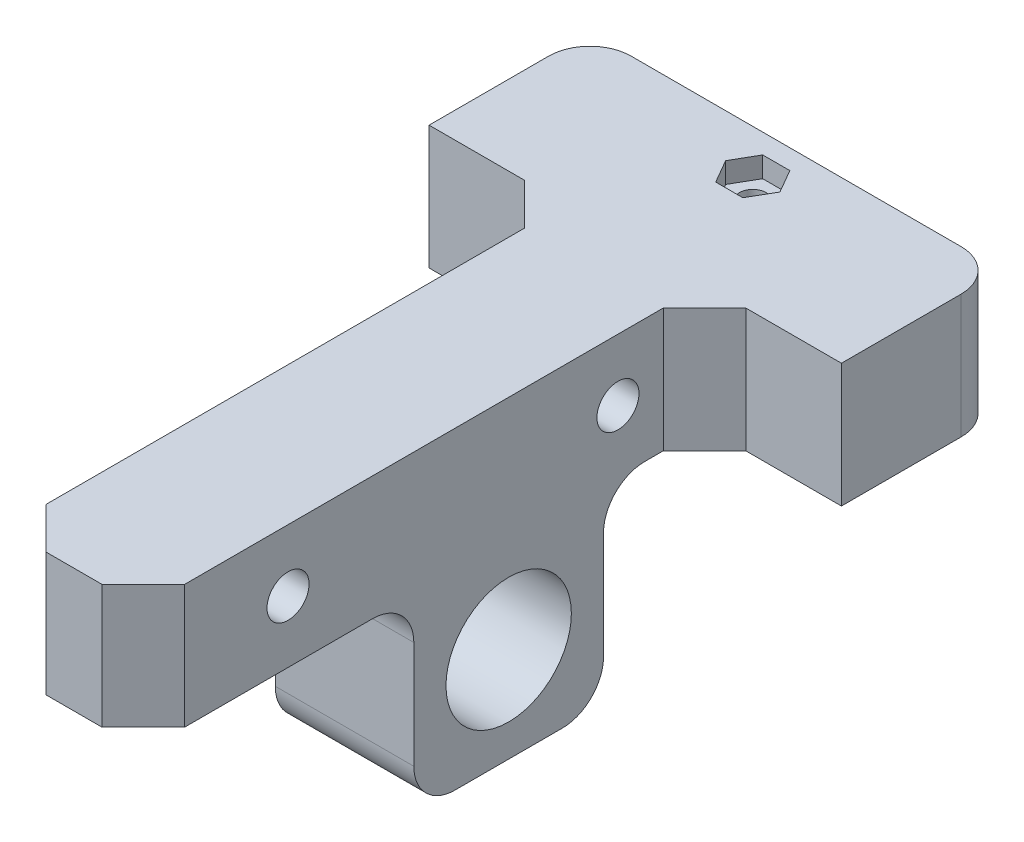
ISO-10303-21;
HEADER;
FILE_DESCRIPTION(('STEP AP214'),'2;1');
FILE_NAME('part.step','',(''),(''),'','','');
FILE_SCHEMA(('AUTOMOTIVE_DESIGN { 1 0 10303 214 1 1 1 1 }'));
ENDSEC;
DATA;
#1=APPLICATION_CONTEXT('core data for automotive mechanical design processes');
#2=APPLICATION_PROTOCOL_DEFINITION('international standard','automotive_design',2000,#1);
#3=PRODUCT_CONTEXT('',#1,'mechanical');
#4=PRODUCT('Part','Part','',(#3));
#5=PRODUCT_RELATED_PRODUCT_CATEGORY('part','',(#4));
#6=PRODUCT_DEFINITION_FORMATION('','',#4);
#7=PRODUCT_DEFINITION_CONTEXT('part definition',#1,'design');
#8=PRODUCT_DEFINITION('design','',#6,#7);
#9=PRODUCT_DEFINITION_SHAPE('','',#8);
#10=(LENGTH_UNIT() NAMED_UNIT(*) SI_UNIT(.MILLI.,.METRE.));
#11=(NAMED_UNIT(*) PLANE_ANGLE_UNIT() SI_UNIT($,.RADIAN.));
#12=(NAMED_UNIT(*) SI_UNIT($,.STERADIAN.) SOLID_ANGLE_UNIT());
#13=UNCERTAINTY_MEASURE_WITH_UNIT(LENGTH_MEASURE(1.E-05),#10,'distance_accuracy_value','');
#14=(GEOMETRIC_REPRESENTATION_CONTEXT(3) GLOBAL_UNCERTAINTY_ASSIGNED_CONTEXT((#13)) GLOBAL_UNIT_ASSIGNED_CONTEXT((#10,
#11,#12)) REPRESENTATION_CONTEXT('',''));
#15=CARTESIAN_POINT('',(0.,0.,0.));
#16=DIRECTION('',(0.,0.,1.));
#17=DIRECTION('',(1.,0.,0.));
#18=AXIS2_PLACEMENT_3D('',#15,#16,#17);
#19=CARTESIAN_POINT('',(8.39999999999999,-23.01,87.55));
#20=DIRECTION('',(1.,0.,0.));
#21=DIRECTION('',(0.,0.,-1.));
#22=AXIS2_PLACEMENT_3D('',#19,#20,#21);
#23=PLANE('',#22);
#24=CARTESIAN_POINT('',(8.39999999999999,7.5,70.));
#25=DIRECTION('',(1.,0.,0.));
#26=DIRECTION('',(0.,0.,-1.));
#27=AXIS2_PLACEMENT_3D('',#24,#25,#26);
#28=CIRCLE('',#27,2.54999999999999);
#29=CARTESIAN_POINT('',(8.39999999999999,7.5,67.45));
#30=VERTEX_POINT('',#29);
#31=EDGE_CURVE('E311',#30,#30,#28,.F.);
#32=ORIENTED_EDGE('',*,*,#31,.T.);
#33=EDGE_LOOP('',(#32));
#34=FACE_BOUND('',#33,.T.);
#35=DIRECTION('',(0.,0.,-1.));
#36=VECTOR('',#35,1.);
#37=CARTESIAN_POINT('',(8.39999999999998,0.,0.));
#38=LINE('',#37,#36);
#39=CARTESIAN_POINT('',(8.39999999999998,0.,26.75));
#40=VERTEX_POINT('',#39);
#41=CARTESIAN_POINT('',(8.39999999999999,0.,24.5));
#42=VERTEX_POINT('',#41);
#43=EDGE_CURVE('E235',#40,#42,#38,.T.);
#44=ORIENTED_EDGE('',*,*,#43,.T.);
#45=DIRECTION('',(0.,1.,0.));
#46=VECTOR('',#45,1.);
#47=CARTESIAN_POINT('',(8.39999999999998,15.,24.5));
#48=LINE('',#47,#46);
#49=CARTESIAN_POINT('',(8.39999999999999,15.,24.5));
#50=VERTEX_POINT('',#49);
#51=EDGE_CURVE('E355',#42,#50,#48,.T.);
#52=ORIENTED_EDGE('',*,*,#51,.T.);
#53=DIRECTION('',(0.,0.,-1.));
#54=VECTOR('',#53,1.);
#55=CARTESIAN_POINT('',(8.39999999999998,15.,0.));
#56=LINE('',#55,#54);
#57=CARTESIAN_POINT('',(8.39999999999999,15.,82.55));
#58=VERTEX_POINT('',#57);
#59=EDGE_CURVE('E379',#58,#50,#56,.T.);
#60=ORIENTED_EDGE('',*,*,#59,.F.);
#61=DIRECTION('',(0.,-1.,0.));
#62=VECTOR('',#61,1.);
#63=CARTESIAN_POINT('',(8.39999999999999,-23.01,82.55));
#64=LINE('',#63,#62);
#65=CARTESIAN_POINT('',(8.39999999999999,0.,82.55));
#66=VERTEX_POINT('',#65);
#67=EDGE_CURVE('E353',#58,#66,#64,.T.);
#68=ORIENTED_EDGE('',*,*,#67,.T.);
#69=DIRECTION('',(0.,0.,-1.));
#70=VECTOR('',#69,1.);
#71=CARTESIAN_POINT('',(8.39999999999998,0.,0.));
#72=LINE('',#71,#70);
#73=CARTESIAN_POINT('',(8.39999999999999,0.,59.75));
#74=VERTEX_POINT('',#73);
#75=EDGE_CURVE('E320',#66,#74,#72,.T.);
#76=ORIENTED_EDGE('',*,*,#75,.T.);
#77=CARTESIAN_POINT('',(8.39999999999999,-5.,59.75));
#78=DIRECTION('',(1.,0.,0.));
#79=DIRECTION('',(0.,0.,-1.));
#80=AXIS2_PLACEMENT_3D('',#77,#78,#79);
#81=CIRCLE('',#80,5.);
#82=CARTESIAN_POINT('',(8.39999999999998,-5.,54.75));
#83=VERTEX_POINT('',#82);
#84=EDGE_CURVE('E251',#74,#83,#81,.F.);
#85=ORIENTED_EDGE('',*,*,#84,.T.);
#86=DIRECTION('',(0.,-1.,0.));
#87=VECTOR('',#86,1.);
#88=CARTESIAN_POINT('',(8.39999999999999,-23.,54.75));
#89=LINE('',#88,#87);
#90=CARTESIAN_POINT('',(8.39999999999999,-18.,54.75));
#91=VERTEX_POINT('',#90);
#92=EDGE_CURVE('E297',#83,#91,#89,.T.);
#93=ORIENTED_EDGE('',*,*,#92,.T.);
#94=CARTESIAN_POINT('',(8.39999999999999,-18.,49.75));
#95=DIRECTION('',(1.,0.,0.));
#96=DIRECTION('',(0.,0.,-1.));
#97=AXIS2_PLACEMENT_3D('',#94,#95,#96);
#98=CIRCLE('',#97,5.);
#99=CARTESIAN_POINT('',(8.39999999999999,-23.,49.75));
#100=VERTEX_POINT('',#99);
#101=EDGE_CURVE('E340',#100,#91,#98,.F.);
#102=ORIENTED_EDGE('',*,*,#101,.F.);
#103=DIRECTION('',(0.,0.,-1.));
#104=VECTOR('',#103,1.);
#105=CARTESIAN_POINT('',(8.39999999999998,-23.,0.));
#106=LINE('',#105,#104);
#107=CARTESIAN_POINT('',(8.39999999999999,-23.,36.75));
#108=VERTEX_POINT('',#107);
#109=EDGE_CURVE('E293',#100,#108,#106,.T.);
#110=ORIENTED_EDGE('',*,*,#109,.T.);
#111=CARTESIAN_POINT('',(8.39999999999999,-18.,36.75));
#112=DIRECTION('',(1.,0.,0.));
#113=DIRECTION('',(0.,0.,-1.));
#114=AXIS2_PLACEMENT_3D('',#111,#112,#113);
#115=CIRCLE('',#114,5.);
#116=CARTESIAN_POINT('',(8.39999999999998,-18.,31.75));
#117=VERTEX_POINT('',#116);
#118=EDGE_CURVE('E343',#117,#108,#115,.F.);
#119=ORIENTED_EDGE('',*,*,#118,.F.);
#120=DIRECTION('',(0.,1.,0.));
#121=VECTOR('',#120,1.);
#122=CARTESIAN_POINT('',(8.39999999999998,-23.,31.75));
#123=LINE('',#122,#121);
#124=CARTESIAN_POINT('',(8.39999999999998,-5.,31.75));
#125=VERTEX_POINT('',#124);
#126=EDGE_CURVE('E249',#117,#125,#123,.T.);
#127=ORIENTED_EDGE('',*,*,#126,.T.);
#128=CARTESIAN_POINT('',(8.39999999999998,-5.,26.75));
#129=DIRECTION('',(1.,0.,0.));
#130=DIRECTION('',(0.,0.,-1.));
#131=AXIS2_PLACEMENT_3D('',#128,#129,#130);
#132=CIRCLE('',#131,5.);
#133=EDGE_CURVE('E226',#125,#40,#132,.F.);
#134=ORIENTED_EDGE('',*,*,#133,.T.);
#135=EDGE_LOOP('',(#44,#52,#60,#68,#76,#85,#93,#102,#110,#119,#127,#134));
#136=FACE_BOUND('',#135,.T.);
#137=CARTESIAN_POINT('',(8.39999999999999,-11.5,43.25));
#138=DIRECTION('',(1.,0.,0.));
#139=DIRECTION('',(0.,0.,-1.));
#140=AXIS2_PLACEMENT_3D('',#137,#138,#139);
#141=CIRCLE('',#140,7.6);
#142=CARTESIAN_POINT('',(8.39999999999999,-11.5,35.65));
#143=VERTEX_POINT('',#142);
#144=EDGE_CURVE('E336',#143,#143,#141,.T.);
#145=ORIENTED_EDGE('',*,*,#144,.F.);
#146=EDGE_LOOP('',(#145));
#147=FACE_BOUND('',#146,.T.);
#148=CARTESIAN_POINT('',(8.39999999999998,7.5,30.));
#149=DIRECTION('',(1.,0.,0.));
#150=DIRECTION('',(0.,0.,-1.));
#151=AXIS2_PLACEMENT_3D('',#148,#149,#150);
#152=CIRCLE('',#151,2.55);
#153=CARTESIAN_POINT('',(8.39999999999998,7.5,27.45));
#154=VERTEX_POINT('',#153);
#155=EDGE_CURVE('E312',#154,#154,#152,.F.);
#156=ORIENTED_EDGE('',*,*,#155,.T.);
#157=EDGE_LOOP('',(#156));
#158=FACE_BOUND('',#157,.T.);
#159=ADVANCED_FACE('F35',(#34,#136,#147,#158),#23,.T.);
#160=CARTESIAN_POINT('',(-8.39999999999999,-23.01,87.55));
#161=DIRECTION('',(0.,0.,1.));
#162=DIRECTION('',(1.,0.,0.));
#163=AXIS2_PLACEMENT_3D('',#160,#161,#162);
#164=PLANE('',#163);
#165=DIRECTION('',(1.,0.,0.));
#166=VECTOR('',#165,1.);
#167=CARTESIAN_POINT('',(0.,15.,87.55));
#168=LINE('',#167,#166);
#169=CARTESIAN_POINT('',(-3.39999999999996,15.,87.55));
#170=VERTEX_POINT('',#169);
#171=CARTESIAN_POINT('',(3.39999999999999,15.,87.55));
#172=VERTEX_POINT('',#171);
#173=EDGE_CURVE('E337',#170,#172,#168,.T.);
#174=ORIENTED_EDGE('',*,*,#173,.F.);
#175=DIRECTION('',(0.,-1.,0.));
#176=VECTOR('',#175,1.);
#177=CARTESIAN_POINT('',(-3.39999999999996,-23.01,87.55));
#178=LINE('',#177,#176);
#179=CARTESIAN_POINT('',(-3.39999999999996,0.,87.55));
#180=VERTEX_POINT('',#179);
#181=EDGE_CURVE('E57',#170,#180,#178,.T.);
#182=ORIENTED_EDGE('',*,*,#181,.T.);
#183=DIRECTION('',(1.,0.,0.));
#184=VECTOR('',#183,1.);
#185=CARTESIAN_POINT('',(0.,0.,87.55));
#186=LINE('',#185,#184);
#187=CARTESIAN_POINT('',(3.39999999999999,0.,87.55));
#188=VERTEX_POINT('',#187);
#189=EDGE_CURVE('E321',#180,#188,#186,.T.);
#190=ORIENTED_EDGE('',*,*,#189,.T.);
#191=DIRECTION('',(0.,1.,0.));
#192=VECTOR('',#191,1.);
#193=CARTESIAN_POINT('',(3.39999999999999,-23.01,87.55));
#194=LINE('',#193,#192);
#195=EDGE_CURVE('E363',#188,#172,#194,.T.);
#196=ORIENTED_EDGE('',*,*,#195,.T.);
#197=EDGE_LOOP('',(#174,#182,#190,#196));
#198=FACE_BOUND('',#197,.T.);
#199=ADVANCED_FACE('F393',(#198),#164,.T.);
#200=CARTESIAN_POINT('',(8.39999999999998,-23.01,19.5));
#201=DIRECTION('',(0.,0.,1.));
#202=DIRECTION('',(1.,0.,0.));
#203=AXIS2_PLACEMENT_3D('',#200,#201,#202);
#204=PLANE('',#203);
#205=DIRECTION('',(1.,0.,0.));
#206=VECTOR('',#205,1.);
#207=CARTESIAN_POINT('',(0.,15.,19.5));
#208=LINE('',#207,#206);
#209=CARTESIAN_POINT('',(13.4,15.,19.5));
#210=VERTEX_POINT('',#209);
#211=CARTESIAN_POINT('',(25.,15.,19.5));
#212=VERTEX_POINT('',#211);
#213=EDGE_CURVE('E332',#210,#212,#208,.T.);
#214=ORIENTED_EDGE('',*,*,#213,.F.);
#215=DIRECTION('',(0.,-1.,0.));
#216=VECTOR('',#215,1.);
#217=CARTESIAN_POINT('',(13.4,0.,19.5));
#218=LINE('',#217,#216);
#219=CARTESIAN_POINT('',(13.4,0.,19.5));
#220=VERTEX_POINT('',#219);
#221=EDGE_CURVE('E357',#210,#220,#218,.T.);
#222=ORIENTED_EDGE('',*,*,#221,.T.);
#223=DIRECTION('',(1.,0.,0.));
#224=VECTOR('',#223,1.);
#225=CARTESIAN_POINT('',(0.,0.,19.5));
#226=LINE('',#225,#224);
#227=CARTESIAN_POINT('',(25.,0.,19.5));
#228=VERTEX_POINT('',#227);
#229=EDGE_CURVE('E243',#220,#228,#226,.T.);
#230=ORIENTED_EDGE('',*,*,#229,.T.);
#231=DIRECTION('',(0.,1.,0.));
#232=VECTOR('',#231,1.);
#233=CARTESIAN_POINT('',(25.,15.,19.5));
#234=LINE('',#233,#232);
#235=EDGE_CURVE('E307',#228,#212,#234,.T.);
#236=ORIENTED_EDGE('',*,*,#235,.T.);
#237=EDGE_LOOP('',(#214,#222,#230,#236));
#238=FACE_BOUND('',#237,.T.);
#239=ADVANCED_FACE('F383',(#238),#204,.T.);
#240=CARTESIAN_POINT('',(-8.4,-23.01,19.5));
#241=DIRECTION('',(-1.,0.,0.));
#242=DIRECTION('',(0.,0.,1.));
#243=AXIS2_PLACEMENT_3D('',#240,#241,#242);
#244=PLANE('',#243);
#245=CARTESIAN_POINT('',(-8.4,7.5,70.));
#246=DIRECTION('',(-1.,0.,0.));
#247=DIRECTION('',(0.,0.,1.));
#248=AXIS2_PLACEMENT_3D('',#245,#246,#247);
#249=CIRCLE('',#248,2.54999999999999);
#250=CARTESIAN_POINT('',(-8.4,7.5,72.55));
#251=VERTEX_POINT('',#250);
#252=EDGE_CURVE('E244',#251,#251,#249,.F.);
#253=ORIENTED_EDGE('',*,*,#252,.T.);
#254=EDGE_LOOP('',(#253));
#255=FACE_BOUND('',#254,.T.);
#256=DIRECTION('',(0.,0.,1.));
#257=VECTOR('',#256,1.);
#258=CARTESIAN_POINT('',(-8.4,15.,0.));
#259=LINE('',#258,#257);
#260=CARTESIAN_POINT('',(-8.4,15.,24.5));
#261=VERTEX_POINT('',#260);
#262=CARTESIAN_POINT('',(-8.39999999999999,15.,82.55));
#263=VERTEX_POINT('',#262);
#264=EDGE_CURVE('E329',#261,#263,#259,.T.);
#265=ORIENTED_EDGE('',*,*,#264,.F.);
#266=DIRECTION('',(0.,-1.,0.));
#267=VECTOR('',#266,1.);
#268=CARTESIAN_POINT('',(-8.4,0.,24.5));
#269=LINE('',#268,#267);
#270=CARTESIAN_POINT('',(-8.4,0.,24.5));
#271=VERTEX_POINT('',#270);
#272=EDGE_CURVE('E351',#261,#271,#269,.T.);
#273=ORIENTED_EDGE('',*,*,#272,.T.);
#274=DIRECTION('',(0.,0.,1.));
#275=VECTOR('',#274,1.);
#276=CARTESIAN_POINT('',(-8.4,0.,0.));
#277=LINE('',#276,#275);
#278=CARTESIAN_POINT('',(-8.4,0.,26.75));
#279=VERTEX_POINT('',#278);
#280=EDGE_CURVE('E315',#271,#279,#277,.T.);
#281=ORIENTED_EDGE('',*,*,#280,.T.);
#282=CARTESIAN_POINT('',(-8.4,-5.,26.75));
#283=DIRECTION('',(-1.,0.,0.));
#284=DIRECTION('',(0.,0.,1.));
#285=AXIS2_PLACEMENT_3D('',#282,#283,#284);
#286=CIRCLE('',#285,5.);
#287=CARTESIAN_POINT('',(-8.4,-5.,31.75));
#288=VERTEX_POINT('',#287);
#289=EDGE_CURVE('E228',#279,#288,#286,.F.);
#290=ORIENTED_EDGE('',*,*,#289,.T.);
#291=DIRECTION('',(0.,-1.,0.));
#292=VECTOR('',#291,1.);
#293=CARTESIAN_POINT('',(-8.4,-23.,31.75));
#294=LINE('',#293,#292);
#295=CARTESIAN_POINT('',(-8.4,-18.,31.75));
#296=VERTEX_POINT('',#295);
#297=EDGE_CURVE('E301',#288,#296,#294,.T.);
#298=ORIENTED_EDGE('',*,*,#297,.T.);
#299=CARTESIAN_POINT('',(-8.4,-18.,36.75));
#300=DIRECTION('',(-1.,0.,0.));
#301=DIRECTION('',(0.,0.,1.));
#302=AXIS2_PLACEMENT_3D('',#299,#300,#301);
#303=CIRCLE('',#302,5.);
#304=CARTESIAN_POINT('',(-8.4,-23.,36.75));
#305=VERTEX_POINT('',#304);
#306=EDGE_CURVE('E341',#305,#296,#303,.F.);
#307=ORIENTED_EDGE('',*,*,#306,.F.);
#308=DIRECTION('',(0.,0.,1.));
#309=VECTOR('',#308,1.);
#310=CARTESIAN_POINT('',(-8.4,-23.,0.));
#311=LINE('',#310,#309);
#312=CARTESIAN_POINT('',(-8.4,-23.,49.75));
#313=VERTEX_POINT('',#312);
#314=EDGE_CURVE('E294',#305,#313,#311,.T.);
#315=ORIENTED_EDGE('',*,*,#314,.T.);
#316=CARTESIAN_POINT('',(-8.4,-18.,49.75));
#317=DIRECTION('',(-1.,0.,0.));
#318=DIRECTION('',(0.,0.,1.));
#319=AXIS2_PLACEMENT_3D('',#316,#317,#318);
#320=CIRCLE('',#319,5.);
#321=CARTESIAN_POINT('',(-8.4,-18.,54.75));
#322=VERTEX_POINT('',#321);
#323=EDGE_CURVE('E338',#322,#313,#320,.F.);
#324=ORIENTED_EDGE('',*,*,#323,.F.);
#325=DIRECTION('',(0.,1.,0.));
#326=VECTOR('',#325,1.);
#327=CARTESIAN_POINT('',(-8.39999999999999,-23.,54.75));
#328=LINE('',#327,#326);
#329=CARTESIAN_POINT('',(-8.39999999999999,-5.,54.75));
#330=VERTEX_POINT('',#329);
#331=EDGE_CURVE('E298',#322,#330,#328,.T.);
#332=ORIENTED_EDGE('',*,*,#331,.T.);
#333=CARTESIAN_POINT('',(-8.39999999999999,-5.,59.75));
#334=DIRECTION('',(-1.,0.,0.));
#335=DIRECTION('',(0.,0.,1.));
#336=AXIS2_PLACEMENT_3D('',#333,#334,#335);
#337=CIRCLE('',#336,5.);
#338=CARTESIAN_POINT('',(-8.39999999999999,0.,59.75));
#339=VERTEX_POINT('',#338);
#340=EDGE_CURVE('E290',#330,#339,#337,.F.);
#341=ORIENTED_EDGE('',*,*,#340,.T.);
#342=DIRECTION('',(0.,0.,1.));
#343=VECTOR('',#342,1.);
#344=CARTESIAN_POINT('',(-8.4,0.,0.));
#345=LINE('',#344,#343);
#346=CARTESIAN_POINT('',(-8.39999999999999,0.,82.55));
#347=VERTEX_POINT('',#346);
#348=EDGE_CURVE('E323',#339,#347,#345,.T.);
#349=ORIENTED_EDGE('',*,*,#348,.T.);
#350=DIRECTION('',(0.,1.,0.));
#351=VECTOR('',#350,1.);
#352=CARTESIAN_POINT('',(-8.39999999999999,-23.01,82.55));
#353=LINE('',#352,#351);
#354=EDGE_CURVE('E347',#347,#263,#353,.T.);
#355=ORIENTED_EDGE('',*,*,#354,.T.);
#356=EDGE_LOOP('',(#265,#273,#281,#290,#298,#307,#315,#324,#332,#341,#349,#355));
#357=FACE_BOUND('',#356,.T.);
#358=CARTESIAN_POINT('',(-8.4,-11.5,43.25));
#359=DIRECTION('',(-1.,0.,0.));
#360=DIRECTION('',(0.,0.,1.));
#361=AXIS2_PLACEMENT_3D('',#358,#359,#360);
#362=CIRCLE('',#361,7.6);
#363=CARTESIAN_POINT('',(-8.4,-11.5,50.85));
#364=VERTEX_POINT('',#363);
#365=EDGE_CURVE('E333',#364,#364,#362,.T.);
#366=ORIENTED_EDGE('',*,*,#365,.F.);
#367=EDGE_LOOP('',(#366));
#368=FACE_BOUND('',#367,.T.);
#369=CARTESIAN_POINT('',(-8.4,7.5,30.));
#370=DIRECTION('',(-1.,0.,0.));
#371=DIRECTION('',(0.,0.,1.));
#372=AXIS2_PLACEMENT_3D('',#369,#370,#371);
#373=CIRCLE('',#372,2.55);
#374=CARTESIAN_POINT('',(-8.4,7.5,32.55));
#375=VERTEX_POINT('',#374);
#376=EDGE_CURVE('E308',#375,#375,#373,.F.);
#377=ORIENTED_EDGE('',*,*,#376,.T.);
#378=EDGE_LOOP('',(#377));
#379=FACE_BOUND('',#378,.T.);
#380=ADVANCED_FACE('F436',(#255,#357,#368,#379),#244,.T.);
#381=CARTESIAN_POINT('',(-25.,-23.01,19.5));
#382=DIRECTION('',(0.,0.,1.));
#383=DIRECTION('',(1.,0.,0.));
#384=AXIS2_PLACEMENT_3D('',#381,#382,#383);
#385=PLANE('',#384);
#386=DIRECTION('',(1.,0.,0.));
#387=VECTOR('',#386,1.);
#388=CARTESIAN_POINT('',(0.,0.,19.5));
#389=LINE('',#388,#387);
#390=CARTESIAN_POINT('',(-25.,0.,19.5));
#391=VERTEX_POINT('',#390);
#392=CARTESIAN_POINT('',(-13.4,0.,19.5));
#393=VERTEX_POINT('',#392);
#394=EDGE_CURVE('E317',#391,#393,#389,.T.);
#395=ORIENTED_EDGE('',*,*,#394,.T.);
#396=DIRECTION('',(0.,1.,0.));
#397=VECTOR('',#396,1.);
#398=CARTESIAN_POINT('',(-13.4,15.,19.5));
#399=LINE('',#398,#397);
#400=CARTESIAN_POINT('',(-13.4,15.,19.5));
#401=VERTEX_POINT('',#400);
#402=EDGE_CURVE('E344',#393,#401,#399,.T.);
#403=ORIENTED_EDGE('',*,*,#402,.T.);
#404=DIRECTION('',(1.,0.,0.));
#405=VECTOR('',#404,1.);
#406=CARTESIAN_POINT('',(0.,15.,19.5));
#407=LINE('',#406,#405);
#408=CARTESIAN_POINT('',(-25.,15.,19.5));
#409=VERTEX_POINT('',#408);
#410=EDGE_CURVE('E326',#409,#401,#407,.T.);
#411=ORIENTED_EDGE('',*,*,#410,.F.);
#412=DIRECTION('',(0.,-1.,0.));
#413=VECTOR('',#412,1.);
#414=CARTESIAN_POINT('',(-25.,15.,19.5));
#415=LINE('',#414,#413);
#416=EDGE_CURVE('E304',#409,#391,#415,.T.);
#417=ORIENTED_EDGE('',*,*,#416,.T.);
#418=EDGE_LOOP('',(#395,#403,#411,#417));
#419=FACE_BOUND('',#418,.T.);
#420=ADVANCED_FACE('F456',(#419),#385,.T.);
#421=CARTESIAN_POINT('',(0.,12.5,0.));
#422=DIRECTION('',(0.,1.,0.));
#423=DIRECTION('',(0.,0.,1.));
#424=AXIS2_PLACEMENT_3D('',#421,#422,#423);
#425=PLANE('',#424);
#426=DIRECTION('',(0.5,0.,-0.866025403784439));
#427=VECTOR('',#426,1.);
#428=CARTESIAN_POINT('',(1.64544826719043,12.5,8.10000000000001));
#429=LINE('',#428,#427);
#430=CARTESIAN_POINT('',(1.64544826719043,12.5,8.10000000000001));
#431=VERTEX_POINT('',#430);
#432=CARTESIAN_POINT('',(3.29089653438087,12.5,5.25000000000001));
#433=VERTEX_POINT('',#432);
#434=EDGE_CURVE('E422',#431,#433,#429,.T.);
#435=ORIENTED_EDGE('',*,*,#434,.T.);
#436=DIRECTION('',(-0.5,0.,-0.866025403784438));
#437=VECTOR('',#436,1.);
#438=CARTESIAN_POINT('',(3.29089653438087,12.5,5.25000000000001));
#439=LINE('',#438,#437);
#440=CARTESIAN_POINT('',(1.64544826719043,12.5,2.40000000000001));
#441=VERTEX_POINT('',#440);
#442=EDGE_CURVE('E601',#433,#441,#439,.T.);
#443=ORIENTED_EDGE('',*,*,#442,.T.);
#444=DIRECTION('',(-1.,0.,0.));
#445=VECTOR('',#444,1.);
#446=CARTESIAN_POINT('',(1.64544826719043,12.5,2.40000000000001));
#447=LINE('',#446,#445);
#448=CARTESIAN_POINT('',(-1.64544826719043,12.5,2.40000000000001));
#449=VERTEX_POINT('',#448);
#450=EDGE_CURVE('E599',#441,#449,#447,.T.);
#451=ORIENTED_EDGE('',*,*,#450,.T.);
#452=DIRECTION('',(-0.5,0.,0.866025403784439));
#453=VECTOR('',#452,1.);
#454=CARTESIAN_POINT('',(-1.64544826719043,12.5,2.40000000000001));
#455=LINE('',#454,#453);
#456=CARTESIAN_POINT('',(-3.29089653438087,12.5,5.25000000000001));
#457=VERTEX_POINT('',#456);
#458=EDGE_CURVE('E596',#449,#457,#455,.T.);
#459=ORIENTED_EDGE('',*,*,#458,.T.);
#460=DIRECTION('',(0.5,0.,0.866025403784438));
#461=VECTOR('',#460,1.);
#462=CARTESIAN_POINT('',(-3.29089653438087,12.5,5.25000000000001));
#463=LINE('',#462,#461);
#464=CARTESIAN_POINT('',(-1.64544826719043,12.5,8.10000000000001));
#465=VERTEX_POINT('',#464);
#466=EDGE_CURVE('E593',#457,#465,#463,.T.);
#467=ORIENTED_EDGE('',*,*,#466,.T.);
#468=DIRECTION('',(1.,0.,0.));
#469=VECTOR('',#468,1.);
#470=CARTESIAN_POINT('',(-1.64544826719043,12.5,8.10000000000001));
#471=LINE('',#470,#469);
#472=EDGE_CURVE('E565',#465,#431,#471,.T.);
#473=ORIENTED_EDGE('',*,*,#472,.T.);
#474=EDGE_LOOP('',(#435,#443,#451,#459,#467,#473));
#475=FACE_BOUND('',#474,.T.);
#476=CARTESIAN_POINT('',(0.,12.5,5.25000000000001));
#477=DIRECTION('',(0.,1.,0.));
#478=DIRECTION('',(0.,0.,1.));
#479=AXIS2_PLACEMENT_3D('',#476,#477,#478);
#480=CIRCLE('',#479,1.6);
#481=CARTESIAN_POINT('',(0.,12.5,6.85000000000001));
#482=VERTEX_POINT('',#481);
#483=EDGE_CURVE('E553',#482,#482,#480,.F.);
#484=ORIENTED_EDGE('',*,*,#483,.T.);
#485=EDGE_LOOP('',(#484));
#486=FACE_BOUND('',#485,.T.);
#487=ADVANCED_FACE('F453',(#475,#486),#425,.T.);
#488=CARTESIAN_POINT('',(0.,0.,5.25000000000001));
#489=DIRECTION('',(0.,1.,0.));
#490=DIRECTION('',(0.,0.,1.));
#491=AXIS2_PLACEMENT_3D('',#488,#489,#490);
#492=CYLINDRICAL_SURFACE('',#491,1.6);
#493=CARTESIAN_POINT('',(0.,0.,5.25000000000001));
#494=DIRECTION('',(0.,1.,0.));
#495=DIRECTION('',(0.,0.,1.));
#496=AXIS2_PLACEMENT_3D('',#493,#494,#495);
#497=CIRCLE('',#496,1.6);
#498=CARTESIAN_POINT('',(0.,0.,6.85000000000001));
#499=VERTEX_POINT('',#498);
#500=EDGE_CURVE('E262',#499,#499,#497,.T.);
#501=ORIENTED_EDGE('',*,*,#500,.F.);
#502=EDGE_LOOP('',(#501));
#503=FACE_BOUND('',#502,.T.);
#504=ORIENTED_EDGE('',*,*,#483,.F.);
#505=EDGE_LOOP('',(#504));
#506=FACE_BOUND('',#505,.T.);
#507=ADVANCED_FACE('F455',(#503,#506),#492,.F.);
#508=CARTESIAN_POINT('',(25.,-23.,31.75));
#509=DIRECTION('',(0.,0.,1.));
#510=DIRECTION('',(1.,0.,0.));
#511=AXIS2_PLACEMENT_3D('',#508,#509,#510);
#512=PLANE('',#511);
#513=ORIENTED_EDGE('',*,*,#297,.F.);
#514=DIRECTION('',(1.,0.,0.));
#515=VECTOR('',#514,1.);
#516=CARTESIAN_POINT('',(25.,-5.,31.75));
#517=LINE('',#516,#515);
#518=EDGE_CURVE('E287',#288,#125,#517,.T.);
#519=ORIENTED_EDGE('',*,*,#518,.T.);
#520=ORIENTED_EDGE('',*,*,#126,.F.);
#521=DIRECTION('',(1.,0.,0.));
#522=VECTOR('',#521,1.);
#523=CARTESIAN_POINT('',(25.,-18.,31.75));
#524=LINE('',#523,#522);
#525=EDGE_CURVE('E284',#117,#296,#524,.F.);
#526=ORIENTED_EDGE('',*,*,#525,.T.);
#527=EDGE_LOOP('',(#513,#519,#520,#526));
#528=FACE_BOUND('',#527,.T.);
#529=ADVANCED_FACE('F463',(#528),#512,.F.);
#530=CARTESIAN_POINT('',(0.,-23.,0.));
#531=DIRECTION('',(0.,1.,0.));
#532=DIRECTION('',(0.,0.,1.));
#533=AXIS2_PLACEMENT_3D('',#530,#531,#532);
#534=PLANE('',#533);
#535=ORIENTED_EDGE('',*,*,#314,.F.);
#536=DIRECTION('',(1.,0.,0.));
#537=VECTOR('',#536,1.);
#538=CARTESIAN_POINT('',(0.,-23.,36.75));
#539=LINE('',#538,#537);
#540=EDGE_CURVE('E272',#305,#108,#539,.T.);
#541=ORIENTED_EDGE('',*,*,#540,.T.);
#542=ORIENTED_EDGE('',*,*,#109,.F.);
#543=DIRECTION('',(-1.,0.,0.));
#544=VECTOR('',#543,1.);
#545=CARTESIAN_POINT('',(0.,-23.,49.75));
#546=LINE('',#545,#544);
#547=EDGE_CURVE('E276',#100,#313,#546,.T.);
#548=ORIENTED_EDGE('',*,*,#547,.T.);
#549=EDGE_LOOP('',(#535,#541,#542,#548));
#550=FACE_BOUND('',#549,.T.);
#551=ADVANCED_FACE('F413',(#550),#534,.F.);
#552=CARTESIAN_POINT('',(0.,-18.,36.75));
#553=DIRECTION('',(1.,0.,0.));
#554=DIRECTION('',(0.,0.,-1.));
#555=AXIS2_PLACEMENT_3D('',#552,#553,#554);
#556=CYLINDRICAL_SURFACE('',#555,5.);
#557=ORIENTED_EDGE('',*,*,#540,.F.);
#558=ORIENTED_EDGE('',*,*,#306,.T.);
#559=ORIENTED_EDGE('',*,*,#525,.F.);
#560=ORIENTED_EDGE('',*,*,#118,.T.);
#561=EDGE_LOOP('',(#557,#558,#559,#560));
#562=FACE_BOUND('',#561,.T.);
#563=ADVANCED_FACE('F415',(#562),#556,.T.);
#564=CARTESIAN_POINT('',(0.,0.,0.));
#565=DIRECTION('',(0.,1.,0.));
#566=DIRECTION('',(0.,0.,1.));
#567=AXIS2_PLACEMENT_3D('',#564,#565,#566);
#568=PLANE('',#567);
#569=ORIENTED_EDGE('',*,*,#500,.T.);
#570=EDGE_LOOP('',(#569));
#571=FACE_BOUND('',#570,.T.);
#572=ORIENTED_EDGE('',*,*,#394,.F.);
#573=DIRECTION('',(0.,0.,1.));
#574=VECTOR('',#573,1.);
#575=CARTESIAN_POINT('',(-25.,0.,0.));
#576=LINE('',#575,#574);
#577=CARTESIAN_POINT('',(-25.,0.,5.00000000000001));
#578=VERTEX_POINT('',#577);
#579=EDGE_CURVE('E258',#578,#391,#576,.T.);
#580=ORIENTED_EDGE('',*,*,#579,.F.);
#581=CARTESIAN_POINT('',(-20.,0.,5.00000000000001));
#582=DIRECTION('',(0.,1.,0.));
#583=DIRECTION('',(0.,0.,1.));
#584=AXIS2_PLACEMENT_3D('',#581,#582,#583);
#585=CIRCLE('',#584,5.);
#586=CARTESIAN_POINT('',(-20.,0.,0.));
#587=VERTEX_POINT('',#586);
#588=EDGE_CURVE('E288',#578,#587,#585,.F.);
#589=ORIENTED_EDGE('',*,*,#588,.T.);
#590=DIRECTION('',(-1.,0.,0.));
#591=VECTOR('',#590,1.);
#592=CARTESIAN_POINT('',(25.,0.,0.));
#593=LINE('',#592,#591);
#594=CARTESIAN_POINT('',(20.,0.,0.));
#595=VERTEX_POINT('',#594);
#596=EDGE_CURVE('E263',#595,#587,#593,.T.);
#597=ORIENTED_EDGE('',*,*,#596,.F.);
#598=CARTESIAN_POINT('',(20.,0.,5.00000000000001));
#599=DIRECTION('',(0.,1.,0.));
#600=DIRECTION('',(0.,0.,1.));
#601=AXIS2_PLACEMENT_3D('',#598,#599,#600);
#602=CIRCLE('',#601,5.);
#603=CARTESIAN_POINT('',(25.,0.,5.00000000000001));
#604=VERTEX_POINT('',#603);
#605=EDGE_CURVE('E231',#595,#604,#602,.F.);
#606=ORIENTED_EDGE('',*,*,#605,.T.);
#607=DIRECTION('',(0.,0.,-1.));
#608=VECTOR('',#607,1.);
#609=CARTESIAN_POINT('',(25.,0.,0.));
#610=LINE('',#609,#608);
#611=EDGE_CURVE('E260',#228,#604,#610,.T.);
#612=ORIENTED_EDGE('',*,*,#611,.F.);
#613=ORIENTED_EDGE('',*,*,#229,.F.);
#614=DIRECTION('',(0.707106781186545,0.,-0.70710678118655));
#615=VECTOR('',#614,1.);
#616=CARTESIAN_POINT('',(16.45,0.,16.4499999999999));
#617=LINE('',#616,#615);
#618=EDGE_CURVE('E11',#220,#42,#617,.F.);
#619=ORIENTED_EDGE('',*,*,#618,.T.);
#620=ORIENTED_EDGE('',*,*,#43,.F.);
#621=DIRECTION('',(1.,0.,0.));
#622=VECTOR('',#621,1.);
#623=CARTESIAN_POINT('',(-25.,0.,26.75));
#624=LINE('',#623,#622);
#625=EDGE_CURVE('E222',#40,#279,#624,.F.);
#626=ORIENTED_EDGE('',*,*,#625,.T.);
#627=ORIENTED_EDGE('',*,*,#280,.F.);
#628=DIRECTION('',(0.70710678118655,0.,0.707106781186545));
#629=VECTOR('',#628,1.);
#630=CARTESIAN_POINT('',(-16.4499999999999,0.,16.4500000000001));
#631=LINE('',#630,#629);
#632=EDGE_CURVE('E372',#271,#393,#631,.F.);
#633=ORIENTED_EDGE('',*,*,#632,.T.);
#634=EDGE_LOOP('',(#572,#580,#589,#597,#606,#612,#613,#619,#620,#626,#627,#633));
#635=FACE_BOUND('',#634,.T.);
#636=ADVANCED_FACE('F237',(#571,#635),#568,.F.);
#637=CARTESIAN_POINT('',(25.,-5.,26.75));
#638=DIRECTION('',(-1.,0.,0.));
#639=DIRECTION('',(0.,0.,1.));
#640=AXIS2_PLACEMENT_3D('',#637,#638,#639);
#641=CYLINDRICAL_SURFACE('',#640,5.);
#642=ORIENTED_EDGE('',*,*,#289,.F.);
#643=ORIENTED_EDGE('',*,*,#625,.F.);
#644=ORIENTED_EDGE('',*,*,#133,.F.);
#645=ORIENTED_EDGE('',*,*,#518,.F.);
#646=EDGE_LOOP('',(#642,#643,#644,#645));
#647=FACE_BOUND('',#646,.T.);
#648=ADVANCED_FACE('F224',(#647),#641,.F.);
#649=ORIENTED_EDGE('',*,*,#189,.F.);
#650=DIRECTION('',(0.707106781186548,0.,0.707106781186546));
#651=VECTOR('',#650,1.);
#652=CARTESIAN_POINT('',(-8.39999999999999,0.,82.55));
#653=LINE('',#652,#651);
#654=EDGE_CURVE('E368',#180,#347,#653,.F.);
#655=ORIENTED_EDGE('',*,*,#654,.T.);
#656=ORIENTED_EDGE('',*,*,#348,.F.);
#657=DIRECTION('',(-1.,0.,0.));
#658=VECTOR('',#657,1.);
#659=CARTESIAN_POINT('',(25.,0.,59.75));
#660=LINE('',#659,#658);
#661=EDGE_CURVE('E268',#339,#74,#660,.F.);
#662=ORIENTED_EDGE('',*,*,#661,.T.);
#663=ORIENTED_EDGE('',*,*,#75,.F.);
#664=DIRECTION('',(0.707106781186547,0.,-0.707106781186549));
#665=VECTOR('',#664,1.);
#666=CARTESIAN_POINT('',(3.39999999999999,0.,87.55));
#667=LINE('',#666,#665);
#668=EDGE_CURVE('E50',#66,#188,#667,.F.);
#669=ORIENTED_EDGE('',*,*,#668,.T.);
#670=EDGE_LOOP('',(#649,#655,#656,#662,#663,#669));
#671=FACE_BOUND('',#670,.T.);
#672=ADVANCED_FACE('F441',(#671),#568,.F.);
#673=CARTESIAN_POINT('',(25.,-23.,54.75));
#674=DIRECTION('',(0.,0.,-1.));
#675=DIRECTION('',(-1.,0.,0.));
#676=AXIS2_PLACEMENT_3D('',#673,#674,#675);
#677=PLANE('',#676);
#678=ORIENTED_EDGE('',*,*,#331,.F.);
#679=DIRECTION('',(-1.,0.,0.));
#680=VECTOR('',#679,1.);
#681=CARTESIAN_POINT('',(25.,-18.,54.75));
#682=LINE('',#681,#680);
#683=EDGE_CURVE('E281',#322,#91,#682,.F.);
#684=ORIENTED_EDGE('',*,*,#683,.T.);
#685=ORIENTED_EDGE('',*,*,#92,.F.);
#686=DIRECTION('',(-1.,0.,0.));
#687=VECTOR('',#686,1.);
#688=CARTESIAN_POINT('',(-25.,-5.,54.75));
#689=LINE('',#688,#687);
#690=EDGE_CURVE('E279',#83,#330,#689,.T.);
#691=ORIENTED_EDGE('',*,*,#690,.T.);
#692=EDGE_LOOP('',(#678,#684,#685,#691));
#693=FACE_BOUND('',#692,.T.);
#694=ADVANCED_FACE('F432',(#693),#677,.F.);
#695=CARTESIAN_POINT('',(25.,-5.,59.75));
#696=DIRECTION('',(1.,0.,0.));
#697=DIRECTION('',(0.,0.,-1.));
#698=AXIS2_PLACEMENT_3D('',#695,#696,#697);
#699=CYLINDRICAL_SURFACE('',#698,5.);
#700=ORIENTED_EDGE('',*,*,#340,.F.);
#701=ORIENTED_EDGE('',*,*,#690,.F.);
#702=ORIENTED_EDGE('',*,*,#84,.F.);
#703=ORIENTED_EDGE('',*,*,#661,.F.);
#704=EDGE_LOOP('',(#700,#701,#702,#703));
#705=FACE_BOUND('',#704,.T.);
#706=ADVANCED_FACE('F439',(#705),#699,.F.);
#707=CARTESIAN_POINT('',(0.,-18.,49.75));
#708=DIRECTION('',(-1.,0.,0.));
#709=DIRECTION('',(0.,0.,1.));
#710=AXIS2_PLACEMENT_3D('',#707,#708,#709);
#711=CYLINDRICAL_SURFACE('',#710,5.);
#712=ORIENTED_EDGE('',*,*,#683,.F.);
#713=ORIENTED_EDGE('',*,*,#323,.T.);
#714=ORIENTED_EDGE('',*,*,#547,.F.);
#715=ORIENTED_EDGE('',*,*,#101,.T.);
#716=EDGE_LOOP('',(#712,#713,#714,#715));
#717=FACE_BOUND('',#716,.T.);
#718=ADVANCED_FACE('F426',(#717),#711,.T.);
#719=CARTESIAN_POINT('',(-20.,15.,5.00000000000001));
#720=DIRECTION('',(0.,-1.,0.));
#721=DIRECTION('',(0.,0.,-1.));
#722=AXIS2_PLACEMENT_3D('',#719,#720,#721);
#723=CYLINDRICAL_SURFACE('',#722,5.);
#724=CARTESIAN_POINT('',(-20.,15.,5.00000000000001));
#725=DIRECTION('',(0.,1.,0.));
#726=DIRECTION('',(0.,0.,1.));
#727=AXIS2_PLACEMENT_3D('',#724,#725,#726);
#728=CIRCLE('',#727,5.);
#729=CARTESIAN_POINT('',(-20.,15.,0.));
#730=VERTEX_POINT('',#729);
#731=CARTESIAN_POINT('',(-25.,15.,5.00000000000001));
#732=VERTEX_POINT('',#731);
#733=EDGE_CURVE('E542',#730,#732,#728,.T.);
#734=ORIENTED_EDGE('',*,*,#733,.F.);
#735=DIRECTION('',(0.,-1.,0.));
#736=VECTOR('',#735,1.);
#737=CARTESIAN_POINT('',(-20.,15.,0.));
#738=LINE('',#737,#736);
#739=EDGE_CURVE('E232',#587,#730,#738,.F.);
#740=ORIENTED_EDGE('',*,*,#739,.F.);
#741=ORIENTED_EDGE('',*,*,#588,.F.);
#742=DIRECTION('',(0.,-1.,0.));
#743=VECTOR('',#742,1.);
#744=CARTESIAN_POINT('',(-25.,15.,5.00000000000001));
#745=LINE('',#744,#743);
#746=EDGE_CURVE('E275',#732,#578,#745,.T.);
#747=ORIENTED_EDGE('',*,*,#746,.F.);
#748=EDGE_LOOP('',(#734,#740,#741,#747));
#749=FACE_BOUND('',#748,.T.);
#750=ADVANCED_FACE('F520',(#749),#723,.T.);
#751=CARTESIAN_POINT('',(25.,15.,0.));
#752=DIRECTION('',(0.,0.,1.));
#753=DIRECTION('',(1.,0.,0.));
#754=AXIS2_PLACEMENT_3D('',#751,#752,#753);
#755=PLANE('',#754);
#756=DIRECTION('',(-1.,0.,0.));
#757=VECTOR('',#756,1.);
#758=CARTESIAN_POINT('',(25.,15.,0.));
#759=LINE('',#758,#757);
#760=CARTESIAN_POINT('',(20.,15.,0.));
#761=VERTEX_POINT('',#760);
#762=EDGE_CURVE('E259',#761,#730,#759,.T.);
#763=ORIENTED_EDGE('',*,*,#762,.F.);
#764=DIRECTION('',(0.,-1.,0.));
#765=VECTOR('',#764,1.);
#766=CARTESIAN_POINT('',(20.,15.,0.));
#767=LINE('',#766,#765);
#768=EDGE_CURVE('E417',#761,#595,#767,.T.);
#769=ORIENTED_EDGE('',*,*,#768,.T.);
#770=ORIENTED_EDGE('',*,*,#596,.T.);
#771=ORIENTED_EDGE('',*,*,#739,.T.);
#772=EDGE_LOOP('',(#763,#769,#770,#771));
#773=FACE_BOUND('',#772,.T.);
#774=ADVANCED_FACE('F639',(#773),#755,.F.);
#775=CARTESIAN_POINT('',(20.,15.,5.00000000000001));
#776=DIRECTION('',(0.,-1.,0.));
#777=DIRECTION('',(0.,0.,-1.));
#778=AXIS2_PLACEMENT_3D('',#775,#776,#777);
#779=CYLINDRICAL_SURFACE('',#778,5.);
#780=CARTESIAN_POINT('',(20.,15.,5.00000000000001));
#781=DIRECTION('',(0.,1.,0.));
#782=DIRECTION('',(0.,0.,1.));
#783=AXIS2_PLACEMENT_3D('',#780,#781,#782);
#784=CIRCLE('',#783,5.);
#785=CARTESIAN_POINT('',(25.,15.,5.00000000000001));
#786=VERTEX_POINT('',#785);
#787=EDGE_CURVE('E546',#786,#761,#784,.T.);
#788=ORIENTED_EDGE('',*,*,#787,.F.);
#789=DIRECTION('',(0.,-1.,0.));
#790=VECTOR('',#789,1.);
#791=CARTESIAN_POINT('',(25.,15.,5.00000000000001));
#792=LINE('',#791,#790);
#793=EDGE_CURVE('E271',#604,#786,#792,.F.);
#794=ORIENTED_EDGE('',*,*,#793,.F.);
#795=ORIENTED_EDGE('',*,*,#605,.F.);
#796=ORIENTED_EDGE('',*,*,#768,.F.);
#797=EDGE_LOOP('',(#788,#794,#795,#796));
#798=FACE_BOUND('',#797,.T.);
#799=ADVANCED_FACE('F482',(#798),#779,.T.);
#800=CARTESIAN_POINT('',(25.,15.,0.));
#801=DIRECTION('',(-1.,0.,0.));
#802=DIRECTION('',(0.,0.,1.));
#803=AXIS2_PLACEMENT_3D('',#800,#801,#802);
#804=PLANE('',#803);
#805=ORIENTED_EDGE('',*,*,#235,.F.);
#806=ORIENTED_EDGE('',*,*,#611,.T.);
#807=ORIENTED_EDGE('',*,*,#793,.T.);
#808=DIRECTION('',(0.,0.,-1.));
#809=VECTOR('',#808,1.);
#810=CARTESIAN_POINT('',(25.,15.,0.));
#811=LINE('',#810,#809);
#812=EDGE_CURVE('E256',#212,#786,#811,.T.);
#813=ORIENTED_EDGE('',*,*,#812,.F.);
#814=EDGE_LOOP('',(#805,#806,#807,#813));
#815=FACE_BOUND('',#814,.T.);
#816=ADVANCED_FACE('F479',(#815),#804,.F.);
#817=CARTESIAN_POINT('',(-25.,15.,0.));
#818=DIRECTION('',(1.,0.,0.));
#819=DIRECTION('',(0.,0.,-1.));
#820=AXIS2_PLACEMENT_3D('',#817,#818,#819);
#821=PLANE('',#820);
#822=ORIENTED_EDGE('',*,*,#416,.F.);
#823=DIRECTION('',(0.,0.,1.));
#824=VECTOR('',#823,1.);
#825=CARTESIAN_POINT('',(-25.,15.,0.));
#826=LINE('',#825,#824);
#827=EDGE_CURVE('E265',#732,#409,#826,.T.);
#828=ORIENTED_EDGE('',*,*,#827,.F.);
#829=ORIENTED_EDGE('',*,*,#746,.T.);
#830=ORIENTED_EDGE('',*,*,#579,.T.);
#831=EDGE_LOOP('',(#822,#828,#829,#830));
#832=FACE_BOUND('',#831,.T.);
#833=ADVANCED_FACE('F481',(#832),#821,.F.);
#834=CARTESIAN_POINT('',(3.29089653438087,12.5,5.25000000000001));
#835=DIRECTION('',(0.866025403784438,0.,-0.5));
#836=DIRECTION('',(-0.5,0.,-0.866025403784439));
#837=AXIS2_PLACEMENT_3D('',#834,#835,#836);
#838=PLANE('',#837);
#839=DIRECTION('',(-0.5,0.,-0.866025403784438));
#840=VECTOR('',#839,1.);
#841=CARTESIAN_POINT('',(3.29089653438087,15.,5.25000000000001));
#842=LINE('',#841,#840);
#843=CARTESIAN_POINT('',(3.29089653438087,15.,5.25000000000001));
#844=VERTEX_POINT('',#843);
#845=CARTESIAN_POINT('',(1.64544826719043,15.,2.40000000000001));
#846=VERTEX_POINT('',#845);
#847=EDGE_CURVE('E587',#844,#846,#842,.T.);
#848=ORIENTED_EDGE('',*,*,#847,.T.);
#849=DIRECTION('',(0.,1.,0.));
#850=VECTOR('',#849,1.);
#851=CARTESIAN_POINT('',(1.64544826719043,12.5,2.40000000000001));
#852=LINE('',#851,#850);
#853=EDGE_CURVE('E566',#441,#846,#852,.T.);
#854=ORIENTED_EDGE('',*,*,#853,.F.);
#855=ORIENTED_EDGE('',*,*,#442,.F.);
#856=DIRECTION('',(0.,1.,0.));
#857=VECTOR('',#856,1.);
#858=CARTESIAN_POINT('',(3.29089653438087,12.5,5.25000000000001));
#859=LINE('',#858,#857);
#860=EDGE_CURVE('E562',#433,#844,#859,.T.);
#861=ORIENTED_EDGE('',*,*,#860,.T.);
#862=EDGE_LOOP('',(#848,#854,#855,#861));
#863=FACE_BOUND('',#862,.T.);
#864=ADVANCED_FACE('F506',(#863),#838,.F.);
#865=CARTESIAN_POINT('',(1.64544826719043,12.5,2.40000000000001));
#866=DIRECTION('',(0.,0.,-1.));
#867=DIRECTION('',(-1.,0.,0.));
#868=AXIS2_PLACEMENT_3D('',#865,#866,#867);
#869=PLANE('',#868);
#870=DIRECTION('',(-1.,0.,0.));
#871=VECTOR('',#870,1.);
#872=CARTESIAN_POINT('',(1.64544826719043,15.,2.40000000000001));
#873=LINE('',#872,#871);
#874=CARTESIAN_POINT('',(-1.64544826719043,15.,2.40000000000001));
#875=VERTEX_POINT('',#874);
#876=EDGE_CURVE('E584',#846,#875,#873,.T.);
#877=ORIENTED_EDGE('',*,*,#876,.T.);
#878=DIRECTION('',(0.,1.,0.));
#879=VECTOR('',#878,1.);
#880=CARTESIAN_POINT('',(-1.64544826719043,12.5,2.40000000000001));
#881=LINE('',#880,#879);
#882=EDGE_CURVE('E568',#449,#875,#881,.T.);
#883=ORIENTED_EDGE('',*,*,#882,.F.);
#884=ORIENTED_EDGE('',*,*,#450,.F.);
#885=ORIENTED_EDGE('',*,*,#853,.T.);
#886=EDGE_LOOP('',(#877,#883,#884,#885));
#887=FACE_BOUND('',#886,.T.);
#888=ADVANCED_FACE('F613',(#887),#869,.F.);
#889=CARTESIAN_POINT('',(-1.64544826719043,12.5,2.40000000000001));
#890=DIRECTION('',(-0.866025403784439,0.,-0.5));
#891=DIRECTION('',(-0.5,0.,0.866025403784439));
#892=AXIS2_PLACEMENT_3D('',#889,#890,#891);
#893=PLANE('',#892);
#894=DIRECTION('',(-0.5,0.,0.866025403784439));
#895=VECTOR('',#894,1.);
#896=CARTESIAN_POINT('',(-1.64544826719043,15.,2.40000000000001));
#897=LINE('',#896,#895);
#898=CARTESIAN_POINT('',(-3.29089653438087,15.,5.25000000000001));
#899=VERTEX_POINT('',#898);
#900=EDGE_CURVE('E581',#875,#899,#897,.T.);
#901=ORIENTED_EDGE('',*,*,#900,.T.);
#902=DIRECTION('',(0.,1.,0.));
#903=VECTOR('',#902,1.);
#904=CARTESIAN_POINT('',(-3.29089653438087,12.5,5.25000000000001));
#905=LINE('',#904,#903);
#906=EDGE_CURVE('E570',#457,#899,#905,.T.);
#907=ORIENTED_EDGE('',*,*,#906,.F.);
#908=ORIENTED_EDGE('',*,*,#458,.F.);
#909=ORIENTED_EDGE('',*,*,#882,.T.);
#910=EDGE_LOOP('',(#901,#907,#908,#909));
#911=FACE_BOUND('',#910,.T.);
#912=ADVANCED_FACE('F617',(#911),#893,.F.);
#913=CARTESIAN_POINT('',(-3.29089653438087,12.5,5.25000000000001));
#914=DIRECTION('',(-0.866025403784438,0.,0.5));
#915=DIRECTION('',(0.5,0.,0.866025403784438));
#916=AXIS2_PLACEMENT_3D('',#913,#914,#915);
#917=PLANE('',#916);
#918=DIRECTION('',(0.5,0.,0.866025403784438));
#919=VECTOR('',#918,1.);
#920=CARTESIAN_POINT('',(-3.29089653438087,15.,5.25000000000001));
#921=LINE('',#920,#919);
#922=CARTESIAN_POINT('',(-1.64544826719043,15.,8.10000000000001));
#923=VERTEX_POINT('',#922);
#924=EDGE_CURVE('E578',#899,#923,#921,.T.);
#925=ORIENTED_EDGE('',*,*,#924,.T.);
#926=DIRECTION('',(0.,1.,0.));
#927=VECTOR('',#926,1.);
#928=CARTESIAN_POINT('',(-1.64544826719043,12.5,8.10000000000001));
#929=LINE('',#928,#927);
#930=EDGE_CURVE('E572',#465,#923,#929,.T.);
#931=ORIENTED_EDGE('',*,*,#930,.F.);
#932=ORIENTED_EDGE('',*,*,#466,.F.);
#933=ORIENTED_EDGE('',*,*,#906,.T.);
#934=EDGE_LOOP('',(#925,#931,#932,#933));
#935=FACE_BOUND('',#934,.T.);
#936=ADVANCED_FACE('F621',(#935),#917,.F.);
#937=CARTESIAN_POINT('',(-1.64544826719043,12.5,8.10000000000001));
#938=DIRECTION('',(0.,0.,1.));
#939=DIRECTION('',(1.,0.,0.));
#940=AXIS2_PLACEMENT_3D('',#937,#938,#939);
#941=PLANE('',#940);
#942=DIRECTION('',(1.,0.,0.));
#943=VECTOR('',#942,1.);
#944=CARTESIAN_POINT('',(-1.64544826719043,15.,8.10000000000001));
#945=LINE('',#944,#943);
#946=CARTESIAN_POINT('',(1.64544826719043,15.,8.10000000000001));
#947=VERTEX_POINT('',#946);
#948=EDGE_CURVE('E575',#923,#947,#945,.T.);
#949=ORIENTED_EDGE('',*,*,#948,.T.);
#950=DIRECTION('',(0.,1.,0.));
#951=VECTOR('',#950,1.);
#952=CARTESIAN_POINT('',(1.64544826719043,12.5,8.10000000000001));
#953=LINE('',#952,#951);
#954=EDGE_CURVE('E556',#431,#947,#953,.T.);
#955=ORIENTED_EDGE('',*,*,#954,.F.);
#956=ORIENTED_EDGE('',*,*,#472,.F.);
#957=ORIENTED_EDGE('',*,*,#930,.T.);
#958=EDGE_LOOP('',(#949,#955,#956,#957));
#959=FACE_BOUND('',#958,.T.);
#960=ADVANCED_FACE('F472',(#959),#941,.F.);
#961=CARTESIAN_POINT('',(1.64544826719043,12.5,8.10000000000001));
#962=DIRECTION('',(0.866025403784439,0.,0.5));
#963=DIRECTION('',(0.5,0.,-0.866025403784439));
#964=AXIS2_PLACEMENT_3D('',#961,#962,#963);
#965=PLANE('',#964);
#966=DIRECTION('',(0.5,0.,-0.866025403784439));
#967=VECTOR('',#966,1.);
#968=CARTESIAN_POINT('',(1.64544826719043,15.,8.10000000000001));
#969=LINE('',#968,#967);
#970=EDGE_CURVE('E348',#947,#844,#969,.T.);
#971=ORIENTED_EDGE('',*,*,#970,.T.);
#972=ORIENTED_EDGE('',*,*,#860,.F.);
#973=ORIENTED_EDGE('',*,*,#434,.F.);
#974=ORIENTED_EDGE('',*,*,#954,.T.);
#975=EDGE_LOOP('',(#971,#972,#973,#974));
#976=FACE_BOUND('',#975,.T.);
#977=ADVANCED_FACE('F523',(#976),#965,.F.);
#978=CARTESIAN_POINT('',(0.,15.,0.));
#979=DIRECTION('',(0.,1.,0.));
#980=DIRECTION('',(0.,0.,1.));
#981=AXIS2_PLACEMENT_3D('',#978,#979,#980);
#982=PLANE('',#981);
#983=ORIENTED_EDGE('',*,*,#970,.F.);
#984=ORIENTED_EDGE('',*,*,#948,.F.);
#985=ORIENTED_EDGE('',*,*,#924,.F.);
#986=ORIENTED_EDGE('',*,*,#900,.F.);
#987=ORIENTED_EDGE('',*,*,#876,.F.);
#988=ORIENTED_EDGE('',*,*,#847,.F.);
#989=EDGE_LOOP('',(#983,#984,#985,#986,#987,#988));
#990=FACE_BOUND('',#989,.T.);
#991=ORIENTED_EDGE('',*,*,#264,.T.);
#992=DIRECTION('',(-0.707106781186548,0.,-0.707106781186546));
#993=VECTOR('',#992,1.);
#994=CARTESIAN_POINT('',(-45.475,15.,45.4750000000001));
#995=LINE('',#994,#993);
#996=EDGE_CURVE('E361',#263,#170,#995,.F.);
#997=ORIENTED_EDGE('',*,*,#996,.T.);
#998=ORIENTED_EDGE('',*,*,#173,.T.);
#999=DIRECTION('',(-0.707106781186547,0.,0.707106781186549));
#1000=VECTOR('',#999,1.);
#1001=CARTESIAN_POINT('',(45.475,15.,45.4749999999999));
#1002=LINE('',#1001,#1000);
#1003=EDGE_CURVE('E359',#172,#58,#1002,.F.);
#1004=ORIENTED_EDGE('',*,*,#1003,.T.);
#1005=ORIENTED_EDGE('',*,*,#59,.T.);
#1006=DIRECTION('',(-0.707106781186545,0.,0.70710678118655));
#1007=VECTOR('',#1006,1.);
#1008=CARTESIAN_POINT('',(8.39999999999998,15.,24.5));
#1009=LINE('',#1008,#1007);
#1010=EDGE_CURVE('E43',#50,#210,#1009,.F.);
#1011=ORIENTED_EDGE('',*,*,#1010,.T.);
#1012=ORIENTED_EDGE('',*,*,#213,.T.);
#1013=ORIENTED_EDGE('',*,*,#812,.T.);
#1014=ORIENTED_EDGE('',*,*,#787,.T.);
#1015=ORIENTED_EDGE('',*,*,#762,.T.);
#1016=ORIENTED_EDGE('',*,*,#733,.T.);
#1017=ORIENTED_EDGE('',*,*,#827,.T.);
#1018=ORIENTED_EDGE('',*,*,#410,.T.);
#1019=DIRECTION('',(-0.70710678118655,0.,-0.707106781186545));
#1020=VECTOR('',#1019,1.);
#1021=CARTESIAN_POINT('',(-13.4,15.,19.5));
#1022=LINE('',#1021,#1020);
#1023=EDGE_CURVE('E370',#401,#261,#1022,.F.);
#1024=ORIENTED_EDGE('',*,*,#1023,.T.);
#1025=EDGE_LOOP('',(#991,#997,#998,#1004,#1005,#1011,#1012,#1013,#1014,#1015,#1016,#1017,#1018,#1024));
#1026=FACE_BOUND('',#1025,.T.);
#1027=ADVANCED_FACE('F376',(#990,#1026),#982,.T.);
#1028=CARTESIAN_POINT('',(12.5,-11.5,43.25));
#1029=DIRECTION('',(-1.,0.,0.));
#1030=DIRECTION('',(0.,0.,1.));
#1031=AXIS2_PLACEMENT_3D('',#1028,#1029,#1030);
#1032=CYLINDRICAL_SURFACE('',#1031,7.6);
#1033=ORIENTED_EDGE('',*,*,#144,.T.);
#1034=EDGE_LOOP('',(#1033));
#1035=FACE_BOUND('',#1034,.T.);
#1036=ORIENTED_EDGE('',*,*,#365,.T.);
#1037=EDGE_LOOP('',(#1036));
#1038=FACE_BOUND('',#1037,.T.);
#1039=ADVANCED_FACE('F497',(#1035,#1038),#1032,.F.);
#1040=CARTESIAN_POINT('',(109.75,7.5,30.));
#1041=DIRECTION('',(-1.,0.,0.));
#1042=DIRECTION('',(0.,0.,1.));
#1043=AXIS2_PLACEMENT_3D('',#1040,#1041,#1042);
#1044=CYLINDRICAL_SURFACE('',#1043,2.55);
#1045=ORIENTED_EDGE('',*,*,#155,.F.);
#1046=EDGE_LOOP('',(#1045));
#1047=FACE_BOUND('',#1046,.T.);
#1048=ORIENTED_EDGE('',*,*,#376,.F.);
#1049=EDGE_LOOP('',(#1048));
#1050=FACE_BOUND('',#1049,.T.);
#1051=ADVANCED_FACE('F493',(#1047,#1050),#1044,.F.);
#1052=CARTESIAN_POINT('',(109.75,7.5,70.));
#1053=DIRECTION('',(-1.,0.,0.));
#1054=DIRECTION('',(0.,0.,1.));
#1055=AXIS2_PLACEMENT_3D('',#1052,#1053,#1054);
#1056=CYLINDRICAL_SURFACE('',#1055,2.54999999999999);
#1057=ORIENTED_EDGE('',*,*,#31,.F.);
#1058=EDGE_LOOP('',(#1057));
#1059=FACE_BOUND('',#1058,.T.);
#1060=ORIENTED_EDGE('',*,*,#252,.F.);
#1061=EDGE_LOOP('',(#1060));
#1062=FACE_BOUND('',#1061,.T.);
#1063=ADVANCED_FACE('F490',(#1059,#1062),#1056,.F.);
#1064=CARTESIAN_POINT('',(-13.4,-23.01,19.5));
#1065=DIRECTION('',(-0.707106781186545,0.,0.70710678118655));
#1066=DIRECTION('',(0.,-1.,0.));
#1067=AXIS2_PLACEMENT_3D('',#1064,#1065,#1066);
#1068=PLANE('',#1067);
#1069=ORIENTED_EDGE('',*,*,#632,.F.);
#1070=ORIENTED_EDGE('',*,*,#272,.F.);
#1071=ORIENTED_EDGE('',*,*,#1023,.F.);
#1072=ORIENTED_EDGE('',*,*,#402,.F.);
#1073=EDGE_LOOP('',(#1069,#1070,#1071,#1072));
#1074=FACE_BOUND('',#1073,.T.);
#1075=ADVANCED_FACE('F451',(#1074),#1068,.T.);
#1076=CARTESIAN_POINT('',(8.39999999999998,-23.01,24.5));
#1077=DIRECTION('',(0.70710678118655,0.,0.707106781186545));
#1078=DIRECTION('',(0.,-1.,0.));
#1079=AXIS2_PLACEMENT_3D('',#1076,#1077,#1078);
#1080=PLANE('',#1079);
#1081=ORIENTED_EDGE('',*,*,#618,.F.);
#1082=ORIENTED_EDGE('',*,*,#221,.F.);
#1083=ORIENTED_EDGE('',*,*,#1010,.F.);
#1084=ORIENTED_EDGE('',*,*,#51,.F.);
#1085=EDGE_LOOP('',(#1081,#1082,#1083,#1084));
#1086=FACE_BOUND('',#1085,.T.);
#1087=ADVANCED_FACE('F387',(#1086),#1080,.T.);
#1088=CARTESIAN_POINT('',(-8.39999999999999,-23.01,82.55));
#1089=DIRECTION('',(0.707106781186546,0.,-0.707106781186548));
#1090=DIRECTION('',(0.,1.,0.));
#1091=AXIS2_PLACEMENT_3D('',#1088,#1089,#1090);
#1092=PLANE('',#1091);
#1093=ORIENTED_EDGE('',*,*,#654,.F.);
#1094=ORIENTED_EDGE('',*,*,#181,.F.);
#1095=ORIENTED_EDGE('',*,*,#996,.F.);
#1096=ORIENTED_EDGE('',*,*,#354,.F.);
#1097=EDGE_LOOP('',(#1093,#1094,#1095,#1096));
#1098=FACE_BOUND('',#1097,.T.);
#1099=ADVANCED_FACE('F445',(#1098),#1092,.F.);
#1100=CARTESIAN_POINT('',(3.39999999999999,-23.01,87.55));
#1101=DIRECTION('',(-0.707106781186549,0.,-0.707106781186547));
#1102=DIRECTION('',(0.,1.,0.));
#1103=AXIS2_PLACEMENT_3D('',#1100,#1101,#1102);
#1104=PLANE('',#1103);
#1105=ORIENTED_EDGE('',*,*,#668,.F.);
#1106=ORIENTED_EDGE('',*,*,#67,.F.);
#1107=ORIENTED_EDGE('',*,*,#1003,.F.);
#1108=ORIENTED_EDGE('',*,*,#195,.F.);
#1109=EDGE_LOOP('',(#1105,#1106,#1107,#1108));
#1110=FACE_BOUND('',#1109,.T.);
#1111=ADVANCED_FACE('F37',(#1110),#1104,.F.);
#1112=CLOSED_SHELL('',(#159,#199,#239,#380,#420,#487,#507,#529,#551,#563,#636,#648,#672,#694,
#706,#718,#750,#774,#799,#816,#833,#864,#888,#912,#936,#960,#977,#1027,#1039,#1051,#1063,#1075,
#1087,#1099,#1111));
#1113=MANIFOLD_SOLID_BREP('B2',#1112);
#1114=ADVANCED_BREP_SHAPE_REPRESENTATION('',(#18,#1113),#14);
#1115=SHAPE_DEFINITION_REPRESENTATION(#9,#1114);
ENDSEC;
END-ISO-10303-21;
